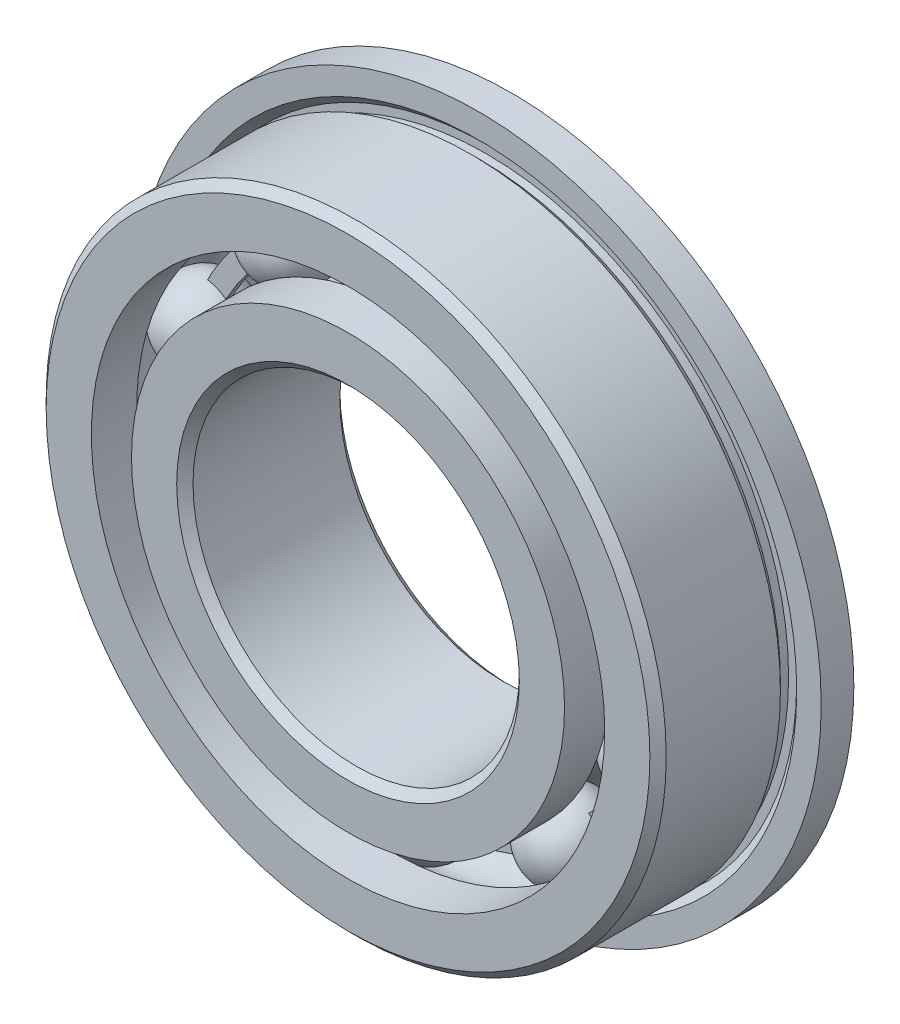
ISO-10303-21;
HEADER;
FILE_DESCRIPTION(('STEP AP214'),'2;1');
FILE_NAME('part.step','',(''),(''),'','','');
FILE_SCHEMA(('AUTOMOTIVE_DESIGN { 1 0 10303 214 1 1 1 1 }'));
ENDSEC;
DATA;
#1=APPLICATION_CONTEXT('core data for automotive mechanical design processes');
#2=APPLICATION_PROTOCOL_DEFINITION('international standard','automotive_design',2000,#1);
#3=PRODUCT_CONTEXT('',#1,'mechanical');
#4=PRODUCT('Part','Part','',(#3));
#5=PRODUCT_RELATED_PRODUCT_CATEGORY('part','',(#4));
#6=PRODUCT_DEFINITION_FORMATION('','',#4);
#7=PRODUCT_DEFINITION_CONTEXT('part definition',#1,'design');
#8=PRODUCT_DEFINITION('design','',#6,#7);
#9=PRODUCT_DEFINITION_SHAPE('','',#8);
#10=(LENGTH_UNIT() NAMED_UNIT(*) SI_UNIT(.MILLI.,.METRE.));
#11=(NAMED_UNIT(*) PLANE_ANGLE_UNIT() SI_UNIT($,.RADIAN.));
#12=(NAMED_UNIT(*) SI_UNIT($,.STERADIAN.) SOLID_ANGLE_UNIT());
#13=UNCERTAINTY_MEASURE_WITH_UNIT(LENGTH_MEASURE(1.E-05),#10,'distance_accuracy_value','');
#14=(GEOMETRIC_REPRESENTATION_CONTEXT(3) GLOBAL_UNCERTAINTY_ASSIGNED_CONTEXT((#13)) GLOBAL_UNIT_ASSIGNED_CONTEXT((#10,
#11,#12)) REPRESENTATION_CONTEXT('',''));
#15=CARTESIAN_POINT('',(0.,0.,0.));
#16=DIRECTION('',(0.,0.,1.));
#17=DIRECTION('',(1.,0.,0.));
#18=AXIS2_PLACEMENT_3D('',#15,#16,#17);
#19=CARTESIAN_POINT('',(-4.26144307912035,5.86537320921842,0.));
#20=DIRECTION('',(0.,0.,1.));
#21=DIRECTION('',(-0.587785252292462,0.809016994374955,0.));
#22=AXIS2_PLACEMENT_3D('',#19,#20,#21);
#23=SPHERICAL_SURFACE('',#22,1.2701441359494);
#24=CARTESIAN_POINT('',(-4.26144307912035,5.86537320921842,1.2701441359494));
#25=VERTEX_POINT('',#24);
#26=VERTEX_LOOP('',#25);
#27=FACE_BOUND('',#26,.T.);
#28=ADVANCED_FACE('F44',(#27),#23,.T.);
#29=CLOSED_SHELL('',(#28));
#30=MANIFOLD_SOLID_BREP('B2',#29);
#31=CARTESIAN_POINT('',(-6.89515974313984,2.24037320921845,0.));
#32=DIRECTION('',(0.,0.,1.));
#33=DIRECTION('',(-0.95105651629515,0.309016994374958,0.));
#34=AXIS2_PLACEMENT_3D('',#31,#32,#33);
#35=SPHERICAL_SURFACE('',#34,1.2701441359494);
#36=CARTESIAN_POINT('',(-6.89515974313984,2.24037320921845,1.2701441359494));
#37=VERTEX_POINT('',#36);
#38=VERTEX_LOOP('',#37);
#39=FACE_BOUND('',#38,.T.);
#40=ADVANCED_FACE('F63',(#39),#35,.T.);
#41=CLOSED_SHELL('',(#40));
#42=MANIFOLD_SOLID_BREP('B6',#41);
#43=CARTESIAN_POINT('',(-6.89515974313988,-2.2403732092183,0.));
#44=DIRECTION('',(0.,0.,1.));
#45=DIRECTION('',(-0.951056516295157,-0.309016994374938,0.));
#46=AXIS2_PLACEMENT_3D('',#43,#44,#45);
#47=SPHERICAL_SURFACE('',#46,1.2701441359494);
#48=CARTESIAN_POINT('',(-6.89515974313988,-2.2403732092183,1.2701441359494));
#49=VERTEX_POINT('',#48);
#50=VERTEX_LOOP('',#49);
#51=FACE_BOUND('',#50,.T.);
#52=ADVANCED_FACE('F82',(#51),#47,.T.);
#53=CLOSED_SHELL('',(#52));
#54=MANIFOLD_SOLID_BREP('B40',#53);
#55=CARTESIAN_POINT('',(-4.26144307912048,-5.86537320921833,0.));
#56=DIRECTION('',(0.,0.,1.));
#57=DIRECTION('',(-0.58778525229248,-0.809016994374942,0.));
#58=AXIS2_PLACEMENT_3D('',#55,#56,#57);
#59=SPHERICAL_SURFACE('',#58,1.2701441359494);
#60=CARTESIAN_POINT('',(-4.26144307912048,-5.86537320921833,1.2701441359494));
#61=VERTEX_POINT('',#60);
#62=VERTEX_LOOP('',#61);
#63=FACE_BOUND('',#62,.T.);
#64=ADVANCED_FACE('F101',(#63),#59,.T.);
#65=CLOSED_SHELL('',(#64));
#66=MANIFOLD_SOLID_BREP('B59',#65);
#67=CARTESIAN_POINT('',(0.,-7.25,0.));
#68=DIRECTION('',(0.,0.,1.));
#69=DIRECTION('',(0.,-1.,0.));
#70=AXIS2_PLACEMENT_3D('',#67,#68,#69);
#71=SPHERICAL_SURFACE('',#70,1.2701441359494);
#72=CARTESIAN_POINT('',(0.,-7.25,1.2701441359494));
#73=VERTEX_POINT('',#72);
#74=VERTEX_LOOP('',#73);
#75=FACE_BOUND('',#74,.T.);
#76=ADVANCED_FACE('F120',(#75),#71,.T.);
#77=CLOSED_SHELL('',(#76));
#78=MANIFOLD_SOLID_BREP('B78',#77);
#79=CARTESIAN_POINT('',(4.2614430791204,-5.86537320921839,0.));
#80=DIRECTION('',(0.,0.,1.));
#81=DIRECTION('',(0.587785252292469,-0.809016994374951,0.));
#82=AXIS2_PLACEMENT_3D('',#79,#80,#81);
#83=SPHERICAL_SURFACE('',#82,1.2701441359494);
#84=CARTESIAN_POINT('',(4.2614430791204,-5.86537320921839,1.2701441359494));
#85=VERTEX_POINT('',#84);
#86=VERTEX_LOOP('',#85);
#87=FACE_BOUND('',#86,.T.);
#88=ADVANCED_FACE('F139',(#87),#83,.T.);
#89=CLOSED_SHELL('',(#88));
#90=MANIFOLD_SOLID_BREP('B97',#89);
#91=CARTESIAN_POINT('',(6.89515974313986,-2.2403732092184,0.));
#92=DIRECTION('',(0.,0.,1.));
#93=DIRECTION('',(0.951056516295152,-0.309016994374952,0.));
#94=AXIS2_PLACEMENT_3D('',#91,#92,#93);
#95=SPHERICAL_SURFACE('',#94,1.2701441359494);
#96=CARTESIAN_POINT('',(6.89515974313986,-2.2403732092184,1.2701441359494));
#97=VERTEX_POINT('',#96);
#98=VERTEX_LOOP('',#97);
#99=FACE_BOUND('',#98,.T.);
#100=ADVANCED_FACE('F158',(#99),#95,.T.);
#101=CLOSED_SHELL('',(#100));
#102=MANIFOLD_SOLID_BREP('B116',#101);
#103=CARTESIAN_POINT('',(6.89515974313987,2.24037320921835,0.));
#104=DIRECTION('',(0.,0.,1.));
#105=DIRECTION('',(0.951056516295155,0.309016994374945,0.));
#106=AXIS2_PLACEMENT_3D('',#103,#104,#105);
#107=SPHERICAL_SURFACE('',#106,1.2701441359494);
#108=CARTESIAN_POINT('',(6.89515974313987,2.24037320921835,1.2701441359494));
#109=VERTEX_POINT('',#108);
#110=VERTEX_LOOP('',#109);
#111=FACE_BOUND('',#110,.T.);
#112=ADVANCED_FACE('F177',(#111),#107,.T.);
#113=CLOSED_SHELL('',(#112));
#114=MANIFOLD_SOLID_BREP('B135',#113);
#115=CARTESIAN_POINT('',(4.26144307912044,5.86537320921836,0.));
#116=DIRECTION('',(0.,0.,1.));
#117=DIRECTION('',(0.587785252292474,0.809016994374947,0.));
#118=AXIS2_PLACEMENT_3D('',#115,#116,#117);
#119=SPHERICAL_SURFACE('',#118,1.2701441359494);
#120=CARTESIAN_POINT('',(4.26144307912044,5.86537320921836,1.2701441359494));
#121=VERTEX_POINT('',#120);
#122=VERTEX_LOOP('',#121);
#123=FACE_BOUND('',#122,.T.);
#124=ADVANCED_FACE('F196',(#123),#119,.T.);
#125=CLOSED_SHELL('',(#124));
#126=MANIFOLD_SOLID_BREP('B154',#125);
#127=CARTESIAN_POINT('',(0.,7.25,0.));
#128=DIRECTION('',(0.,0.,1.));
#129=DIRECTION('',(0.,1.,0.));
#130=AXIS2_PLACEMENT_3D('',#127,#128,#129);
#131=SPHERICAL_SURFACE('',#130,1.2701441359494);
#132=CARTESIAN_POINT('',(0.,7.25,1.2701441359494));
#133=VERTEX_POINT('',#132);
#134=VERTEX_LOOP('',#133);
#135=FACE_BOUND('',#134,.T.);
#136=ADVANCED_FACE('F217',(#135),#131,.T.);
#137=CLOSED_SHELL('',(#136));
#138=MANIFOLD_SOLID_BREP('B173',#137);
#139=CARTESIAN_POINT('',(0.,7.55769230769231,0.102564102564102));
#140=DIRECTION('',(0.,0.,-1.));
#141=DIRECTION('',(-1.,0.,0.));
#142=AXIS2_PLACEMENT_3D('',#139,#140,#141);
#143=PLANE('',#142);
#144=CARTESIAN_POINT('',(0.,0.,0.102564102564102));
#145=DIRECTION('',(0.,0.,1.));
#146=DIRECTION('',(1.,0.,0.));
#147=AXIS2_PLACEMENT_3D('',#144,#145,#146);
#148=CIRCLE('',#147,6.94230769230769);
#149=CARTESIAN_POINT('',(6.94230769230769,0.,0.102564102564102));
#150=VERTEX_POINT('',#149);
#151=EDGE_CURVE('E216',#150,#150,#148,.T.);
#152=ORIENTED_EDGE('',*,*,#151,.F.);
#153=EDGE_LOOP('',(#152));
#154=FACE_BOUND('',#153,.T.);
#155=CARTESIAN_POINT('',(0.,0.,0.102564102564102));
#156=DIRECTION('',(0.,0.,1.));
#157=DIRECTION('',(1.,0.,0.));
#158=AXIS2_PLACEMENT_3D('',#155,#156,#157);
#159=CIRCLE('',#158,7.55769230769231);
#160=CARTESIAN_POINT('',(7.55769230769231,0.,0.102564102564102));
#161=VERTEX_POINT('',#160);
#162=EDGE_CURVE('E250',#161,#161,#159,.T.);
#163=ORIENTED_EDGE('',*,*,#162,.T.);
#164=EDGE_LOOP('',(#163));
#165=FACE_BOUND('',#164,.T.);
#166=ADVANCED_FACE('F236',(#154,#165),#143,.F.);
#167=CARTESIAN_POINT('',(0.,0.,2.5));
#168=DIRECTION('',(0.,0.,1.));
#169=DIRECTION('',(1.,0.,0.));
#170=AXIS2_PLACEMENT_3D('',#167,#168,#169);
#171=CYLINDRICAL_SURFACE('',#170,6.94230769230769);
#172=CARTESIAN_POINT('',(0.,0.,-0.102564102564102));
#173=DIRECTION('',(0.,0.,1.));
#174=DIRECTION('',(1.,0.,0.));
#175=AXIS2_PLACEMENT_3D('',#172,#173,#174);
#176=CIRCLE('',#175,6.94230769230769);
#177=CARTESIAN_POINT('',(6.94230769230769,0.,-0.102564102564102));
#178=VERTEX_POINT('',#177);
#179=EDGE_CURVE('E242',#178,#178,#176,.T.);
#180=ORIENTED_EDGE('',*,*,#179,.F.);
#181=EDGE_LOOP('',(#180));
#182=FACE_BOUND('',#181,.T.);
#183=ORIENTED_EDGE('',*,*,#151,.T.);
#184=EDGE_LOOP('',(#183));
#185=FACE_BOUND('',#184,.T.);
#186=ADVANCED_FACE('F265',(#182,#185),#171,.F.);
#187=CARTESIAN_POINT('',(0.,7.55769230769231,-0.102564102564102));
#188=DIRECTION('',(0.,0.,1.));
#189=DIRECTION('',(1.,0.,0.));
#190=AXIS2_PLACEMENT_3D('',#187,#188,#189);
#191=PLANE('',#190);
#192=CARTESIAN_POINT('',(0.,0.,-0.102564102564102));
#193=DIRECTION('',(0.,0.,1.));
#194=DIRECTION('',(1.,0.,0.));
#195=AXIS2_PLACEMENT_3D('',#192,#193,#194);
#196=CIRCLE('',#195,7.55769230769231);
#197=CARTESIAN_POINT('',(7.55769230769231,0.,-0.102564102564102));
#198=VERTEX_POINT('',#197);
#199=EDGE_CURVE('E246',#198,#198,#196,.T.);
#200=ORIENTED_EDGE('',*,*,#199,.F.);
#201=EDGE_LOOP('',(#200));
#202=FACE_BOUND('',#201,.T.);
#203=ORIENTED_EDGE('',*,*,#179,.T.);
#204=EDGE_LOOP('',(#203));
#205=FACE_BOUND('',#204,.T.);
#206=ADVANCED_FACE('F260',(#202,#205),#191,.F.);
#207=CARTESIAN_POINT('',(0.,0.,2.5));
#208=DIRECTION('',(0.,0.,1.));
#209=DIRECTION('',(1.,0.,0.));
#210=AXIS2_PLACEMENT_3D('',#207,#208,#209);
#211=CYLINDRICAL_SURFACE('',#210,7.55769230769231);
#212=ORIENTED_EDGE('',*,*,#162,.F.);
#213=EDGE_LOOP('',(#212));
#214=FACE_BOUND('',#213,.T.);
#215=ORIENTED_EDGE('',*,*,#199,.T.);
#216=EDGE_LOOP('',(#215));
#217=FACE_BOUND('',#216,.T.);
#218=ADVANCED_FACE('F257',(#214,#217),#211,.T.);
#219=CLOSED_SHELL('',(#166,#186,#206,#218));
#220=MANIFOLD_SOLID_BREP('B192',#219);
#221=CARTESIAN_POINT('',(0.,6.63461538461538,2.5));
#222=DIRECTION('',(0.,0.,-1.));
#223=DIRECTION('',(-1.,0.,0.));
#224=AXIS2_PLACEMENT_3D('',#221,#222,#223);
#225=PLANE('',#224);
#226=CARTESIAN_POINT('',(0.,0.,2.5));
#227=DIRECTION('',(0.,0.,1.));
#228=DIRECTION('',(1.,0.,0.));
#229=AXIS2_PLACEMENT_3D('',#226,#227,#228);
#230=CIRCLE('',#229,5.25);
#231=CARTESIAN_POINT('',(5.25,0.,2.5));
#232=VERTEX_POINT('',#231);
#233=EDGE_CURVE('E325',#232,#232,#230,.T.);
#234=ORIENTED_EDGE('',*,*,#233,.F.);
#235=EDGE_LOOP('',(#234));
#236=FACE_BOUND('',#235,.T.);
#237=CARTESIAN_POINT('',(0.,0.,2.5));
#238=DIRECTION('',(0.,0.,1.));
#239=DIRECTION('',(1.,0.,0.));
#240=AXIS2_PLACEMENT_3D('',#237,#238,#239);
#241=CIRCLE('',#240,6.63461538461538);
#242=CARTESIAN_POINT('',(6.63461538461538,0.,2.5));
#243=VERTEX_POINT('',#242);
#244=EDGE_CURVE('E235',#243,#243,#241,.T.);
#245=ORIENTED_EDGE('',*,*,#244,.T.);
#246=EDGE_LOOP('',(#245));
#247=FACE_BOUND('',#246,.T.);
#248=ADVANCED_FACE('F297',(#236,#247),#225,.F.);
#249=CARTESIAN_POINT('',(0.,0.,2.5));
#250=DIRECTION('',(0.,0.,1.));
#251=DIRECTION('',(1.,0.,0.));
#252=AXIS2_PLACEMENT_3D('',#249,#250,#251);
#253=CYLINDRICAL_SURFACE('',#252,6.63461538461538);
#254=ORIENTED_EDGE('',*,*,#244,.F.);
#255=EDGE_LOOP('',(#254));
#256=FACE_BOUND('',#255,.T.);
#257=CARTESIAN_POINT('',(0.,0.,1.11111111111111));
#258=DIRECTION('',(0.,0.,1.));
#259=DIRECTION('',(1.,0.,0.));
#260=AXIS2_PLACEMENT_3D('',#257,#258,#259);
#261=CIRCLE('',#260,6.63461538461538);
#262=CARTESIAN_POINT('',(6.63461538461538,0.,1.11111111111111));
#263=VERTEX_POINT('',#262);
#264=EDGE_CURVE('E303',#263,#263,#261,.T.);
#265=ORIENTED_EDGE('',*,*,#264,.T.);
#266=EDGE_LOOP('',(#265));
#267=FACE_BOUND('',#266,.T.);
#268=ADVANCED_FACE('F332',(#256,#267),#253,.T.);
#269=CARTESIAN_POINT('',(0.,0.,0.));
#270=DIRECTION('',(0.,0.,1.));
#271=DIRECTION('',(1.,0.,0.));
#272=AXIS2_PLACEMENT_3D('',#269,#270,#271);
#273=TOROIDAL_SURFACE('',#272,7.24999999999999,1.27014413594939);
#274=ORIENTED_EDGE('',*,*,#264,.F.);
#275=EDGE_LOOP('',(#274));
#276=FACE_BOUND('',#275,.T.);
#277=CARTESIAN_POINT('',(0.,0.,-1.11111111111111));
#278=DIRECTION('',(0.,0.,1.));
#279=DIRECTION('',(1.,0.,0.));
#280=AXIS2_PLACEMENT_3D('',#277,#278,#279);
#281=CIRCLE('',#280,6.63461538461538);
#282=CARTESIAN_POINT('',(6.63461538461538,0.,-1.11111111111111));
#283=VERTEX_POINT('',#282);
#284=EDGE_CURVE('E307',#283,#283,#281,.T.);
#285=ORIENTED_EDGE('',*,*,#284,.T.);
#286=EDGE_LOOP('',(#285));
#287=FACE_BOUND('',#286,.T.);
#288=ADVANCED_FACE('F336',(#276,#287),#273,.F.);
#289=CARTESIAN_POINT('',(0.,0.,2.5));
#290=DIRECTION('',(0.,0.,1.));
#291=DIRECTION('',(1.,0.,0.));
#292=AXIS2_PLACEMENT_3D('',#289,#290,#291);
#293=CYLINDRICAL_SURFACE('',#292,6.63461538461538);
#294=ORIENTED_EDGE('',*,*,#284,.F.);
#295=EDGE_LOOP('',(#294));
#296=FACE_BOUND('',#295,.T.);
#297=CARTESIAN_POINT('',(0.,0.,-2.5));
#298=DIRECTION('',(0.,0.,1.));
#299=DIRECTION('',(1.,0.,0.));
#300=AXIS2_PLACEMENT_3D('',#297,#298,#299);
#301=CIRCLE('',#300,6.63461538461538);
#302=CARTESIAN_POINT('',(6.63461538461538,0.,-2.5));
#303=VERTEX_POINT('',#302);
#304=EDGE_CURVE('E311',#303,#303,#301,.T.);
#305=ORIENTED_EDGE('',*,*,#304,.T.);
#306=EDGE_LOOP('',(#305));
#307=FACE_BOUND('',#306,.T.);
#308=ADVANCED_FACE('F341',(#296,#307),#293,.T.);
#309=CARTESIAN_POINT('',(0.,5.25,-2.5));
#310=DIRECTION('',(0.,0.,1.));
#311=DIRECTION('',(1.,0.,0.));
#312=AXIS2_PLACEMENT_3D('',#309,#310,#311);
#313=PLANE('',#312);
#314=ORIENTED_EDGE('',*,*,#304,.F.);
#315=EDGE_LOOP('',(#314));
#316=FACE_BOUND('',#315,.T.);
#317=CARTESIAN_POINT('',(0.,0.,-2.5));
#318=DIRECTION('',(0.,0.,1.));
#319=DIRECTION('',(1.,0.,0.));
#320=AXIS2_PLACEMENT_3D('',#317,#318,#319);
#321=CIRCLE('',#320,5.25);
#322=CARTESIAN_POINT('',(5.25,0.,-2.5));
#323=VERTEX_POINT('',#322);
#324=EDGE_CURVE('E316',#323,#323,#321,.T.);
#325=ORIENTED_EDGE('',*,*,#324,.T.);
#326=EDGE_LOOP('',(#325));
#327=FACE_BOUND('',#326,.T.);
#328=ADVANCED_FACE('F347',(#316,#327),#313,.F.);
#329=CARTESIAN_POINT('',(0.,0.,-2.25));
#330=DIRECTION('',(0.,0.,-1.));
#331=DIRECTION('',(-1.,0.,0.));
#332=AXIS2_PLACEMENT_3D('',#329,#330,#331);
#333=CONICAL_SURFACE('',#332,5.,0.785398163397452);
#334=ORIENTED_EDGE('',*,*,#324,.F.);
#335=EDGE_LOOP('',(#334));
#336=FACE_BOUND('',#335,.T.);
#337=CARTESIAN_POINT('',(0.,0.,-2.25));
#338=DIRECTION('',(0.,0.,1.));
#339=DIRECTION('',(1.,0.,0.));
#340=AXIS2_PLACEMENT_3D('',#337,#338,#339);
#341=CIRCLE('',#340,5.);
#342=CARTESIAN_POINT('',(5.,0.,-2.25));
#343=VERTEX_POINT('',#342);
#344=EDGE_CURVE('E319',#343,#343,#341,.T.);
#345=ORIENTED_EDGE('',*,*,#344,.T.);
#346=EDGE_LOOP('',(#345));
#347=FACE_BOUND('',#346,.T.);
#348=ADVANCED_FACE('F351',(#336,#347),#333,.F.);
#349=CARTESIAN_POINT('',(0.,0.,2.5));
#350=DIRECTION('',(0.,0.,1.));
#351=DIRECTION('',(1.,0.,0.));
#352=AXIS2_PLACEMENT_3D('',#349,#350,#351);
#353=CYLINDRICAL_SURFACE('',#352,5.);
#354=ORIENTED_EDGE('',*,*,#344,.F.);
#355=EDGE_LOOP('',(#354));
#356=FACE_BOUND('',#355,.T.);
#357=CARTESIAN_POINT('',(0.,0.,2.25));
#358=DIRECTION('',(0.,0.,1.));
#359=DIRECTION('',(1.,0.,0.));
#360=AXIS2_PLACEMENT_3D('',#357,#358,#359);
#361=CIRCLE('',#360,5.);
#362=CARTESIAN_POINT('',(5.,0.,2.25));
#363=VERTEX_POINT('',#362);
#364=EDGE_CURVE('E322',#363,#363,#361,.T.);
#365=ORIENTED_EDGE('',*,*,#364,.T.);
#366=EDGE_LOOP('',(#365));
#367=FACE_BOUND('',#366,.T.);
#368=ADVANCED_FACE('F355',(#356,#367),#353,.F.);
#369=CARTESIAN_POINT('',(0.,0.,2.5));
#370=DIRECTION('',(0.,0.,1.));
#371=DIRECTION('',(1.,0.,0.));
#372=AXIS2_PLACEMENT_3D('',#369,#370,#371);
#373=CONICAL_SURFACE('',#372,5.25,0.785398163397443);
#374=ORIENTED_EDGE('',*,*,#364,.F.);
#375=EDGE_LOOP('',(#374));
#376=FACE_BOUND('',#375,.T.);
#377=ORIENTED_EDGE('',*,*,#233,.T.);
#378=EDGE_LOOP('',(#377));
#379=FACE_BOUND('',#378,.T.);
#380=ADVANCED_FACE('F329',(#376,#379),#373,.F.);
#381=CLOSED_SHELL('',(#248,#268,#288,#308,#328,#348,#368,#380));
#382=MANIFOLD_SOLID_BREP('B211',#381);
#383=CARTESIAN_POINT('',(0.,0.,2.5));
#384=DIRECTION('',(0.,0.,1.));
#385=DIRECTION('',(1.,0.,0.));
#386=AXIS2_PLACEMENT_3D('',#383,#384,#385);
#387=CYLINDRICAL_SURFACE('',#386,9.5);
#388=CARTESIAN_POINT('',(0.,0.,2.25));
#389=DIRECTION('',(0.,0.,1.));
#390=DIRECTION('',(1.,0.,0.));
#391=AXIS2_PLACEMENT_3D('',#388,#389,#390);
#392=CIRCLE('',#391,9.5);
#393=CARTESIAN_POINT('',(9.5,0.,2.25));
#394=VERTEX_POINT('',#393);
#395=EDGE_CURVE('E446',#394,#394,#392,.T.);
#396=ORIENTED_EDGE('',*,*,#395,.F.);
#397=EDGE_LOOP('',(#396));
#398=FACE_BOUND('',#397,.T.);
#399=CARTESIAN_POINT('',(0.,0.,-1.25));
#400=DIRECTION('',(0.,0.,1.));
#401=DIRECTION('',(1.,0.,0.));
#402=AXIS2_PLACEMENT_3D('',#399,#400,#401);
#403=CIRCLE('',#402,9.5);
#404=CARTESIAN_POINT('',(9.5,0.,-1.25));
#405=VERTEX_POINT('',#404);
#406=EDGE_CURVE('E296',#405,#405,#403,.T.);
#407=ORIENTED_EDGE('',*,*,#406,.T.);
#408=EDGE_LOOP('',(#407));
#409=FACE_BOUND('',#408,.T.);
#410=ADVANCED_FACE('F403',(#398,#409),#387,.T.);
#411=CARTESIAN_POINT('',(0.,0.,-1.5));
#412=DIRECTION('',(0.,0.,1.));
#413=DIRECTION('',(1.,0.,0.));
#414=AXIS2_PLACEMENT_3D('',#411,#412,#413);
#415=CONICAL_SURFACE('',#414,9.25,0.785398163397436);
#416=ORIENTED_EDGE('',*,*,#406,.F.);
#417=EDGE_LOOP('',(#416));
#418=FACE_BOUND('',#417,.T.);
#419=CARTESIAN_POINT('',(0.,0.,-1.5));
#420=DIRECTION('',(0.,0.,1.));
#421=DIRECTION('',(1.,0.,0.));
#422=AXIS2_PLACEMENT_3D('',#419,#420,#421);
#423=CIRCLE('',#422,9.25);
#424=CARTESIAN_POINT('',(9.25,0.,-1.5));
#425=VERTEX_POINT('',#424);
#426=EDGE_CURVE('E409',#425,#425,#423,.T.);
#427=ORIENTED_EDGE('',*,*,#426,.T.);
#428=EDGE_LOOP('',(#427));
#429=FACE_BOUND('',#428,.T.);
#430=ADVANCED_FACE('F453',(#418,#429),#415,.T.);
#431=CARTESIAN_POINT('',(0.,0.,2.5));
#432=DIRECTION('',(0.,0.,1.));
#433=DIRECTION('',(1.,0.,0.));
#434=AXIS2_PLACEMENT_3D('',#431,#432,#433);
#435=CYLINDRICAL_SURFACE('',#434,9.25);
#436=ORIENTED_EDGE('',*,*,#426,.F.);
#437=EDGE_LOOP('',(#436));
#438=FACE_BOUND('',#437,.T.);
#439=CARTESIAN_POINT('',(0.,0.,-1.75));
#440=DIRECTION('',(0.,0.,1.));
#441=DIRECTION('',(1.,0.,0.));
#442=AXIS2_PLACEMENT_3D('',#439,#440,#441);
#443=CIRCLE('',#442,9.25);
#444=CARTESIAN_POINT('',(9.25,0.,-1.75));
#445=VERTEX_POINT('',#444);
#446=EDGE_CURVE('E413',#445,#445,#443,.T.);
#447=ORIENTED_EDGE('',*,*,#446,.T.);
#448=EDGE_LOOP('',(#447));
#449=FACE_BOUND('',#448,.T.);
#450=ADVANCED_FACE('F457',(#438,#449),#435,.T.);
#451=CARTESIAN_POINT('',(0.,9.5,-1.75));
#452=DIRECTION('',(0.,0.,-1.));
#453=DIRECTION('',(-1.,0.,0.));
#454=AXIS2_PLACEMENT_3D('',#451,#452,#453);
#455=PLANE('',#454);
#456=ORIENTED_EDGE('',*,*,#446,.F.);
#457=EDGE_LOOP('',(#456));
#458=FACE_BOUND('',#457,.T.);
#459=CARTESIAN_POINT('',(0.,0.,-1.75));
#460=DIRECTION('',(0.,0.,1.));
#461=DIRECTION('',(1.,0.,0.));
#462=AXIS2_PLACEMENT_3D('',#459,#460,#461);
#463=CIRCLE('',#462,9.5);
#464=CARTESIAN_POINT('',(9.5,0.,-1.75));
#465=VERTEX_POINT('',#464);
#466=EDGE_CURVE('E417',#465,#465,#463,.T.);
#467=ORIENTED_EDGE('',*,*,#466,.T.);
#468=EDGE_LOOP('',(#467));
#469=FACE_BOUND('',#468,.T.);
#470=ADVANCED_FACE('F462',(#458,#469),#455,.F.);
#471=CARTESIAN_POINT('',(0.,0.,-1.5));
#472=DIRECTION('',(0.,0.,1.));
#473=DIRECTION('',(1.,0.,0.));
#474=AXIS2_PLACEMENT_3D('',#471,#472,#473);
#475=CONICAL_SURFACE('',#474,9.75,0.785398163397445);
#476=ORIENTED_EDGE('',*,*,#466,.F.);
#477=EDGE_LOOP('',(#476));
#478=FACE_BOUND('',#477,.T.);
#479=CARTESIAN_POINT('',(0.,0.,-1.5));
#480=DIRECTION('',(0.,0.,1.));
#481=DIRECTION('',(1.,0.,0.));
#482=AXIS2_PLACEMENT_3D('',#479,#480,#481);
#483=CIRCLE('',#482,9.75);
#484=CARTESIAN_POINT('',(9.75,0.,-1.5));
#485=VERTEX_POINT('',#484);
#486=EDGE_CURVE('E422',#485,#485,#483,.T.);
#487=ORIENTED_EDGE('',*,*,#486,.T.);
#488=EDGE_LOOP('',(#487));
#489=FACE_BOUND('',#488,.T.);
#490=ADVANCED_FACE('F468',(#478,#489),#475,.F.);
#491=CARTESIAN_POINT('',(0.,10.5,-1.5));
#492=DIRECTION('',(0.,0.,-1.));
#493=DIRECTION('',(-1.,0.,0.));
#494=AXIS2_PLACEMENT_3D('',#491,#492,#493);
#495=PLANE('',#494);
#496=ORIENTED_EDGE('',*,*,#486,.F.);
#497=EDGE_LOOP('',(#496));
#498=FACE_BOUND('',#497,.T.);
#499=CARTESIAN_POINT('',(0.,0.,-1.5));
#500=DIRECTION('',(0.,0.,1.));
#501=DIRECTION('',(1.,0.,0.));
#502=AXIS2_PLACEMENT_3D('',#499,#500,#501);
#503=CIRCLE('',#502,10.5);
#504=CARTESIAN_POINT('',(10.5,0.,-1.5));
#505=VERTEX_POINT('',#504);
#506=EDGE_CURVE('E425',#505,#505,#503,.T.);
#507=ORIENTED_EDGE('',*,*,#506,.T.);
#508=EDGE_LOOP('',(#507));
#509=FACE_BOUND('',#508,.T.);
#510=ADVANCED_FACE('F472',(#498,#509),#495,.F.);
#511=CARTESIAN_POINT('',(0.,0.,2.5));
#512=DIRECTION('',(0.,0.,1.));
#513=DIRECTION('',(1.,0.,0.));
#514=AXIS2_PLACEMENT_3D('',#511,#512,#513);
#515=CYLINDRICAL_SURFACE('',#514,10.5);
#516=ORIENTED_EDGE('',*,*,#506,.F.);
#517=EDGE_LOOP('',(#516));
#518=FACE_BOUND('',#517,.T.);
#519=CARTESIAN_POINT('',(0.,0.,-2.5));
#520=DIRECTION('',(0.,0.,1.));
#521=DIRECTION('',(1.,0.,0.));
#522=AXIS2_PLACEMENT_3D('',#519,#520,#521);
#523=CIRCLE('',#522,10.5);
#524=CARTESIAN_POINT('',(10.5,0.,-2.5));
#525=VERTEX_POINT('',#524);
#526=EDGE_CURVE('E428',#525,#525,#523,.T.);
#527=ORIENTED_EDGE('',*,*,#526,.T.);
#528=EDGE_LOOP('',(#527));
#529=FACE_BOUND('',#528,.T.);
#530=ADVANCED_FACE('F476',(#518,#529),#515,.T.);
#531=CARTESIAN_POINT('',(0.,9.25,-2.5));
#532=DIRECTION('',(0.,0.,1.));
#533=DIRECTION('',(1.,0.,0.));
#534=AXIS2_PLACEMENT_3D('',#531,#532,#533);
#535=PLANE('',#534);
#536=ORIENTED_EDGE('',*,*,#526,.F.);
#537=EDGE_LOOP('',(#536));
#538=FACE_BOUND('',#537,.T.);
#539=CARTESIAN_POINT('',(0.,0.,-2.5));
#540=DIRECTION('',(0.,0.,1.));
#541=DIRECTION('',(1.,0.,0.));
#542=AXIS2_PLACEMENT_3D('',#539,#540,#541);
#543=CIRCLE('',#542,7.86538461538461);
#544=CARTESIAN_POINT('',(7.86538461538461,0.,-2.5));
#545=VERTEX_POINT('',#544);
#546=EDGE_CURVE('E431',#545,#545,#543,.T.);
#547=ORIENTED_EDGE('',*,*,#546,.T.);
#548=EDGE_LOOP('',(#547));
#549=FACE_BOUND('',#548,.T.);
#550=ADVANCED_FACE('F480',(#538,#549),#535,.F.);
#551=CARTESIAN_POINT('',(0.,0.,2.5));
#552=DIRECTION('',(0.,0.,1.));
#553=DIRECTION('',(1.,0.,0.));
#554=AXIS2_PLACEMENT_3D('',#551,#552,#553);
#555=CYLINDRICAL_SURFACE('',#554,7.86538461538461);
#556=ORIENTED_EDGE('',*,*,#546,.F.);
#557=EDGE_LOOP('',(#556));
#558=FACE_BOUND('',#557,.T.);
#559=CARTESIAN_POINT('',(0.,0.,-1.11111111111111));
#560=DIRECTION('',(0.,0.,1.));
#561=DIRECTION('',(1.,0.,0.));
#562=AXIS2_PLACEMENT_3D('',#559,#560,#561);
#563=CIRCLE('',#562,7.86538461538461);
#564=CARTESIAN_POINT('',(7.86538461538461,0.,-1.11111111111111));
#565=VERTEX_POINT('',#564);
#566=EDGE_CURVE('E434',#565,#565,#563,.T.);
#567=ORIENTED_EDGE('',*,*,#566,.T.);
#568=EDGE_LOOP('',(#567));
#569=FACE_BOUND('',#568,.T.);
#570=ADVANCED_FACE('F484',(#558,#569),#555,.F.);
#571=CARTESIAN_POINT('',(0.,0.,0.));
#572=DIRECTION('',(0.,0.,1.));
#573=DIRECTION('',(1.,0.,0.));
#574=AXIS2_PLACEMENT_3D('',#571,#572,#573);
#575=TOROIDAL_SURFACE('',#574,7.25,1.2701441359494);
#576=ORIENTED_EDGE('',*,*,#566,.F.);
#577=EDGE_LOOP('',(#576));
#578=FACE_BOUND('',#577,.T.);
#579=CARTESIAN_POINT('',(0.,0.,1.11111111111111));
#580=DIRECTION('',(0.,0.,1.));
#581=DIRECTION('',(1.,0.,0.));
#582=AXIS2_PLACEMENT_3D('',#579,#580,#581);
#583=CIRCLE('',#582,7.86538461538461);
#584=CARTESIAN_POINT('',(7.86538461538461,0.,1.11111111111111));
#585=VERTEX_POINT('',#584);
#586=EDGE_CURVE('E437',#585,#585,#583,.T.);
#587=ORIENTED_EDGE('',*,*,#586,.T.);
#588=EDGE_LOOP('',(#587));
#589=FACE_BOUND('',#588,.T.);
#590=ADVANCED_FACE('F488',(#578,#589),#575,.F.);
#591=CARTESIAN_POINT('',(0.,0.,2.5));
#592=DIRECTION('',(0.,0.,1.));
#593=DIRECTION('',(1.,0.,0.));
#594=AXIS2_PLACEMENT_3D('',#591,#592,#593);
#595=CYLINDRICAL_SURFACE('',#594,7.86538461538461);
#596=ORIENTED_EDGE('',*,*,#586,.F.);
#597=EDGE_LOOP('',(#596));
#598=FACE_BOUND('',#597,.T.);
#599=CARTESIAN_POINT('',(0.,0.,2.5));
#600=DIRECTION('',(0.,0.,1.));
#601=DIRECTION('',(1.,0.,0.));
#602=AXIS2_PLACEMENT_3D('',#599,#600,#601);
#603=CIRCLE('',#602,7.86538461538461);
#604=CARTESIAN_POINT('',(7.86538461538461,0.,2.5));
#605=VERTEX_POINT('',#604);
#606=EDGE_CURVE('E440',#605,#605,#603,.T.);
#607=ORIENTED_EDGE('',*,*,#606,.T.);
#608=EDGE_LOOP('',(#607));
#609=FACE_BOUND('',#608,.T.);
#610=ADVANCED_FACE('F492',(#598,#609),#595,.F.);
#611=CARTESIAN_POINT('',(0.,9.25,2.5));
#612=DIRECTION('',(0.,0.,-1.));
#613=DIRECTION('',(-1.,0.,0.));
#614=AXIS2_PLACEMENT_3D('',#611,#612,#613);
#615=PLANE('',#614);
#616=ORIENTED_EDGE('',*,*,#606,.F.);
#617=EDGE_LOOP('',(#616));
#618=FACE_BOUND('',#617,.T.);
#619=CARTESIAN_POINT('',(0.,0.,2.5));
#620=DIRECTION('',(0.,0.,1.));
#621=DIRECTION('',(1.,0.,0.));
#622=AXIS2_PLACEMENT_3D('',#619,#620,#621);
#623=CIRCLE('',#622,9.25);
#624=CARTESIAN_POINT('',(9.25,0.,2.5));
#625=VERTEX_POINT('',#624);
#626=EDGE_CURVE('E443',#625,#625,#623,.T.);
#627=ORIENTED_EDGE('',*,*,#626,.T.);
#628=EDGE_LOOP('',(#627));
#629=FACE_BOUND('',#628,.T.);
#630=ADVANCED_FACE('F496',(#618,#629),#615,.F.);
#631=CARTESIAN_POINT('',(0.,0.,2.25));
#632=DIRECTION('',(0.,0.,-1.));
#633=DIRECTION('',(-1.,0.,0.));
#634=AXIS2_PLACEMENT_3D('',#631,#632,#633);
#635=CONICAL_SURFACE('',#634,9.5,0.785398163397457);
#636=ORIENTED_EDGE('',*,*,#626,.F.);
#637=EDGE_LOOP('',(#636));
#638=FACE_BOUND('',#637,.T.);
#639=ORIENTED_EDGE('',*,*,#395,.T.);
#640=EDGE_LOOP('',(#639));
#641=FACE_BOUND('',#640,.T.);
#642=ADVANCED_FACE('F450',(#638,#641),#635,.T.);
#643=CLOSED_SHELL('',(#410,#430,#450,#470,#490,#510,#530,#550,#570,#590,#610,#630,#642));
#644=MANIFOLD_SOLID_BREP('B230',#643);
#645=ADVANCED_BREP_SHAPE_REPRESENTATION('',(#18,#30,#42,#54,#66,#78,#90,#102,#114,#126,#138,
#220,#382,#644),#14);
#646=SHAPE_DEFINITION_REPRESENTATION(#9,#645);
ENDSEC;
END-ISO-10303-21;
